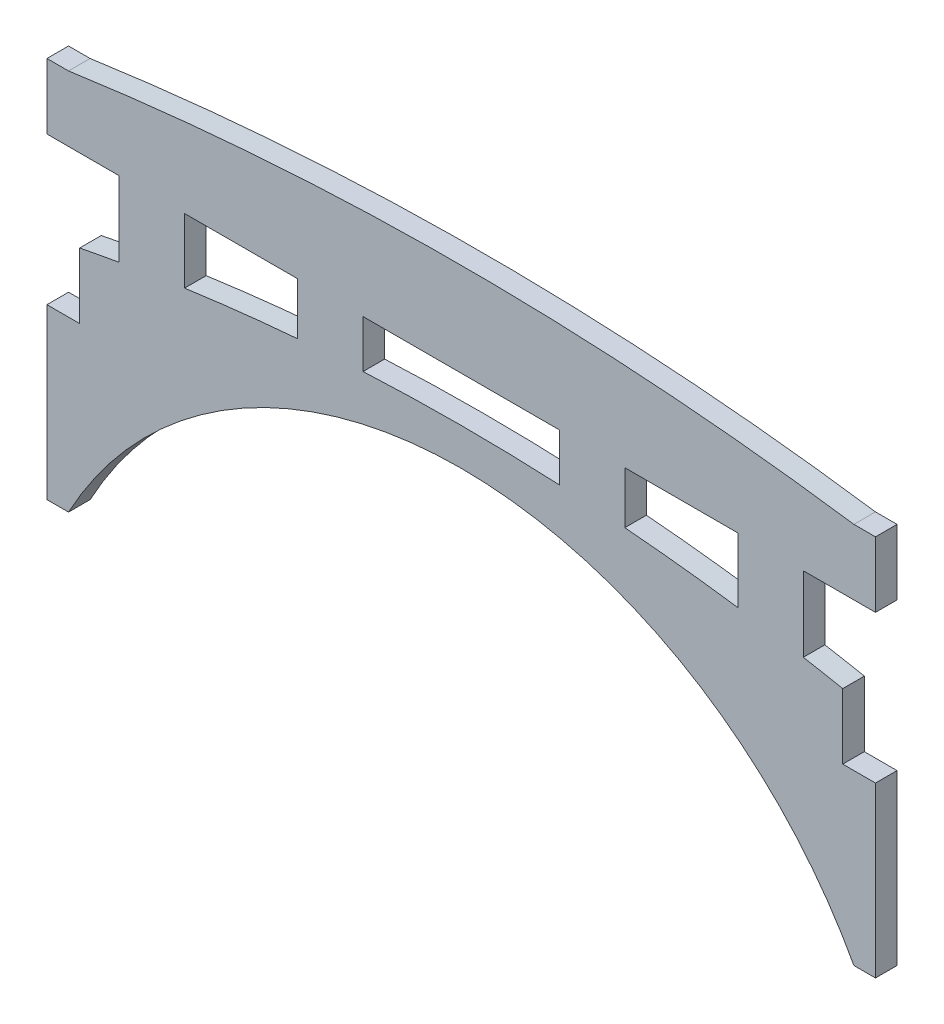
ISO-10303-21;
HEADER;
FILE_DESCRIPTION(('STEP AP214'),'2;1');
FILE_NAME('part.step','',(''),(''),'','','');
FILE_SCHEMA(('AUTOMOTIVE_DESIGN { 1 0 10303 214 1 1 1 1 }'));
ENDSEC;
DATA;
#1=APPLICATION_CONTEXT('core data for automotive mechanical design processes');
#2=APPLICATION_PROTOCOL_DEFINITION('international standard','automotive_design',2000,#1);
#3=PRODUCT_CONTEXT('',#1,'mechanical');
#4=PRODUCT('Part','Part','',(#3));
#5=PRODUCT_RELATED_PRODUCT_CATEGORY('part','',(#4));
#6=PRODUCT_DEFINITION_FORMATION('','',#4);
#7=PRODUCT_DEFINITION_CONTEXT('part definition',#1,'design');
#8=PRODUCT_DEFINITION('design','',#6,#7);
#9=PRODUCT_DEFINITION_SHAPE('','',#8);
#10=(LENGTH_UNIT() NAMED_UNIT(*) SI_UNIT(.MILLI.,.METRE.));
#11=(NAMED_UNIT(*) PLANE_ANGLE_UNIT() SI_UNIT($,.RADIAN.));
#12=(NAMED_UNIT(*) SI_UNIT($,.STERADIAN.) SOLID_ANGLE_UNIT());
#13=UNCERTAINTY_MEASURE_WITH_UNIT(LENGTH_MEASURE(1.E-05),#10,'distance_accuracy_value','');
#14=(GEOMETRIC_REPRESENTATION_CONTEXT(3) GLOBAL_UNCERTAINTY_ASSIGNED_CONTEXT((#13)) GLOBAL_UNIT_ASSIGNED_CONTEXT((#10,
#11,#12)) REPRESENTATION_CONTEXT('',''));
#15=CARTESIAN_POINT('',(0.,0.,0.));
#16=DIRECTION('',(0.,0.,1.));
#17=DIRECTION('',(1.,0.,0.));
#18=AXIS2_PLACEMENT_3D('',#15,#16,#17);
#19=CARTESIAN_POINT('',(60.,-32.3840841295497,3.3));
#20=DIRECTION('',(0.,0.,-1.));
#21=DIRECTION('',(-1.,0.,0.));
#22=AXIS2_PLACEMENT_3D('',#19,#20,#21);
#23=PLANE('',#22);
#24=DIRECTION('',(-1.,0.,0.));
#25=VECTOR('',#24,1.);
#26=CARTESIAN_POINT('',(45.,48.38,3.3));
#27=LINE('',#26,#25);
#28=CARTESIAN_POINT('',(75.,48.38,3.3));
#29=VERTEX_POINT('',#28);
#30=CARTESIAN_POINT('',(45.,48.38,3.3));
#31=VERTEX_POINT('',#30);
#32=EDGE_CURVE('E281',#29,#31,#27,.T.);
#33=ORIENTED_EDGE('',*,*,#32,.F.);
#34=DIRECTION('',(0.,1.,0.));
#35=VECTOR('',#34,1.);
#36=CARTESIAN_POINT('',(75.,48.38,3.3));
#37=LINE('',#36,#35);
#38=CARTESIAN_POINT('',(75.,41.1012105523663,3.3));
#39=VERTEX_POINT('',#38);
#40=EDGE_CURVE('E295',#39,#29,#37,.T.);
#41=ORIENTED_EDGE('',*,*,#40,.F.);
#42=CARTESIAN_POINT('',(60.,-260.904605071318,3.3));
#43=DIRECTION('',(0.,0.,-1.));
#44=DIRECTION('',(-1.,0.,0.));
#45=AXIS2_PLACEMENT_3D('',#42,#43,#44);
#46=CIRCLE('',#45,302.378095553443);
#47=CARTESIAN_POINT('',(45.,41.1012105523663,3.3));
#48=VERTEX_POINT('',#47);
#49=EDGE_CURVE('E288',#48,#39,#46,.T.);
#50=ORIENTED_EDGE('',*,*,#49,.F.);
#51=DIRECTION('',(0.,-1.,0.));
#52=VECTOR('',#51,1.);
#53=CARTESIAN_POINT('',(45.,48.38,3.3));
#54=LINE('',#53,#52);
#55=EDGE_CURVE('E289',#31,#48,#54,.T.);
#56=ORIENTED_EDGE('',*,*,#55,.F.);
#57=EDGE_LOOP('',(#33,#41,#50,#56));
#58=FACE_BOUND('',#57,.T.);
#59=CARTESIAN_POINT('',(60.,-32.3840841295497,3.3));
#60=DIRECTION('',(0.,0.,-1.));
#61=DIRECTION('',(-1.,0.,0.));
#62=AXIS2_PLACEMENT_3D('',#59,#60,#61);
#63=CIRCLE('',#62,68.1815877265245);
#64=CARTESIAN_POINT('',(0.,0.,3.3));
#65=VERTEX_POINT('',#64);
#66=CARTESIAN_POINT('',(120.,0.,3.3));
#67=VERTEX_POINT('',#66);
#68=EDGE_CURVE('E347',#65,#67,#63,.T.);
#69=ORIENTED_EDGE('',*,*,#68,.T.);
#70=DIRECTION('',(1.,0.,0.));
#71=VECTOR('',#70,1.);
#72=CARTESIAN_POINT('',(120.,0.,3.3));
#73=LINE('',#72,#71);
#74=CARTESIAN_POINT('',(123.3,0.,3.3));
#75=VERTEX_POINT('',#74);
#76=EDGE_CURVE('E349',#67,#75,#73,.T.);
#77=ORIENTED_EDGE('',*,*,#76,.T.);
#78=DIRECTION('',(0.,1.,0.));
#79=VECTOR('',#78,1.);
#80=CARTESIAN_POINT('',(123.3,0.,3.3));
#81=LINE('',#80,#79);
#82=CARTESIAN_POINT('',(123.3,25.8,3.3));
#83=VERTEX_POINT('',#82);
#84=EDGE_CURVE('E355',#75,#83,#81,.T.);
#85=ORIENTED_EDGE('',*,*,#84,.T.);
#86=DIRECTION('',(-1.,0.,0.));
#87=VECTOR('',#86,1.);
#88=CARTESIAN_POINT('',(123.3,25.8,3.3));
#89=LINE('',#88,#87);
#90=CARTESIAN_POINT('',(118.3,25.8,3.3));
#91=VERTEX_POINT('',#90);
#92=EDGE_CURVE('E351',#83,#91,#89,.T.);
#93=ORIENTED_EDGE('',*,*,#92,.T.);
#94=DIRECTION('',(0.,1.,0.));
#95=VECTOR('',#94,1.);
#96=CARTESIAN_POINT('',(118.3,25.8,3.3));
#97=LINE('',#96,#95);
#98=CARTESIAN_POINT('',(118.3,35.8,3.3));
#99=VERTEX_POINT('',#98);
#100=EDGE_CURVE('E359',#91,#99,#97,.T.);
#101=ORIENTED_EDGE('',*,*,#100,.T.);
#102=CARTESIAN_POINT('',(60.,-260.904605071318,3.3));
#103=DIRECTION('',(0.,0.,1.));
#104=DIRECTION('',(-1.,0.,0.));
#105=AXIS2_PLACEMENT_3D('',#102,#103,#104);
#106=CIRCLE('',#105,302.378095553443);
#107=CARTESIAN_POINT('',(112.269095695303,36.9216098690764,3.3));
#108=VERTEX_POINT('',#107);
#109=EDGE_CURVE('E360',#99,#108,#106,.T.);
#110=ORIENTED_EDGE('',*,*,#109,.T.);
#111=DIRECTION('',(0.,1.,0.));
#112=VECTOR('',#111,1.);
#113=CARTESIAN_POINT('',(112.269095695303,36.9216098690764,3.3));
#114=LINE('',#113,#112);
#115=CARTESIAN_POINT('',(112.269095695303,48.38,3.3));
#116=VERTEX_POINT('',#115);
#117=EDGE_CURVE('E357',#108,#116,#114,.T.);
#118=ORIENTED_EDGE('',*,*,#117,.T.);
#119=DIRECTION('',(1.,0.,0.));
#120=VECTOR('',#119,1.);
#121=CARTESIAN_POINT('',(112.269095695303,48.38,3.3));
#122=LINE('',#121,#120);
#123=CARTESIAN_POINT('',(123.3,48.38,3.3));
#124=VERTEX_POINT('',#123);
#125=EDGE_CURVE('E362',#116,#124,#122,.T.);
#126=ORIENTED_EDGE('',*,*,#125,.T.);
#127=DIRECTION('',(0.,1.,0.));
#128=VECTOR('',#127,1.);
#129=CARTESIAN_POINT('',(123.3,48.38,3.3));
#130=LINE('',#129,#128);
#131=CARTESIAN_POINT('',(123.3,58.38,3.3));
#132=VERTEX_POINT('',#131);
#133=EDGE_CURVE('E365',#124,#132,#130,.T.);
#134=ORIENTED_EDGE('',*,*,#133,.T.);
#135=DIRECTION('',(-1.,0.,0.));
#136=VECTOR('',#135,1.);
#137=CARTESIAN_POINT('',(123.3,58.38,3.3));
#138=LINE('',#137,#136);
#139=CARTESIAN_POINT('',(120.,58.38,3.3));
#140=VERTEX_POINT('',#139);
#141=EDGE_CURVE('E368',#132,#140,#138,.T.);
#142=ORIENTED_EDGE('',*,*,#141,.T.);
#143=CARTESIAN_POINT('',(60.,-359.120589344752,3.3));
#144=DIRECTION('',(0.,0.,1.));
#145=DIRECTION('',(-1.,0.,0.));
#146=AXIS2_PLACEMENT_3D('',#143,#144,#145);
#147=CIRCLE('',#146,421.789926507516);
#148=CARTESIAN_POINT('',(0.,58.38,3.3));
#149=VERTEX_POINT('',#148);
#150=EDGE_CURVE('E366',#140,#149,#147,.T.);
#151=ORIENTED_EDGE('',*,*,#150,.T.);
#152=DIRECTION('',(-1.,0.,0.));
#153=VECTOR('',#152,1.);
#154=CARTESIAN_POINT('',(-3.3,58.38,3.3));
#155=LINE('',#154,#153);
#156=CARTESIAN_POINT('',(-3.3,58.38,3.3));
#157=VERTEX_POINT('',#156);
#158=EDGE_CURVE('E367',#149,#157,#155,.T.);
#159=ORIENTED_EDGE('',*,*,#158,.T.);
#160=DIRECTION('',(0.,-1.,0.));
#161=VECTOR('',#160,1.);
#162=CARTESIAN_POINT('',(-3.3,48.38,3.3));
#163=LINE('',#162,#161);
#164=CARTESIAN_POINT('',(-3.3,48.38,3.3));
#165=VERTEX_POINT('',#164);
#166=EDGE_CURVE('E375',#157,#165,#163,.T.);
#167=ORIENTED_EDGE('',*,*,#166,.T.);
#168=DIRECTION('',(1.,0.,0.));
#169=VECTOR('',#168,1.);
#170=CARTESIAN_POINT('',(-3.3,48.38,3.3));
#171=LINE('',#170,#169);
#172=CARTESIAN_POINT('',(7.73090430469667,48.38,3.3));
#173=VERTEX_POINT('',#172);
#174=EDGE_CURVE('E372',#165,#173,#171,.T.);
#175=ORIENTED_EDGE('',*,*,#174,.T.);
#176=DIRECTION('',(0.,-1.,0.));
#177=VECTOR('',#176,1.);
#178=CARTESIAN_POINT('',(7.73090430469667,36.9216098690764,3.3));
#179=LINE('',#178,#177);
#180=CARTESIAN_POINT('',(7.73090430469667,36.9216098690764,3.3));
#181=VERTEX_POINT('',#180);
#182=EDGE_CURVE('E376',#173,#181,#179,.T.);
#183=ORIENTED_EDGE('',*,*,#182,.T.);
#184=CARTESIAN_POINT('',(60.,-260.904605071318,3.3));
#185=DIRECTION('',(0.,0.,1.));
#186=DIRECTION('',(-1.,0.,0.));
#187=AXIS2_PLACEMENT_3D('',#184,#185,#186);
#188=CIRCLE('',#187,302.378095553443);
#189=CARTESIAN_POINT('',(1.70000000000001,35.8,3.3));
#190=VERTEX_POINT('',#189);
#191=EDGE_CURVE('E378',#181,#190,#188,.T.);
#192=ORIENTED_EDGE('',*,*,#191,.T.);
#193=DIRECTION('',(0.,-1.,0.));
#194=VECTOR('',#193,1.);
#195=CARTESIAN_POINT('',(1.70000000000001,25.8,3.3));
#196=LINE('',#195,#194);
#197=CARTESIAN_POINT('',(1.70000000000001,25.8,3.3));
#198=VERTEX_POINT('',#197);
#199=EDGE_CURVE('E379',#190,#198,#196,.T.);
#200=ORIENTED_EDGE('',*,*,#199,.T.);
#201=DIRECTION('',(-1.,0.,0.));
#202=VECTOR('',#201,1.);
#203=CARTESIAN_POINT('',(-3.3,25.8,3.3));
#204=LINE('',#203,#202);
#205=CARTESIAN_POINT('',(-3.3,25.8,3.3));
#206=VERTEX_POINT('',#205);
#207=EDGE_CURVE('E385',#198,#206,#204,.T.);
#208=ORIENTED_EDGE('',*,*,#207,.T.);
#209=DIRECTION('',(0.,-1.,0.));
#210=VECTOR('',#209,1.);
#211=CARTESIAN_POINT('',(-3.3,0.,3.3));
#212=LINE('',#211,#210);
#213=CARTESIAN_POINT('',(-3.3,0.,3.3));
#214=VERTEX_POINT('',#213);
#215=EDGE_CURVE('E383',#206,#214,#212,.T.);
#216=ORIENTED_EDGE('',*,*,#215,.T.);
#217=DIRECTION('',(1.,0.,0.));
#218=VECTOR('',#217,1.);
#219=CARTESIAN_POINT('',(0.,0.,3.3));
#220=LINE('',#219,#218);
#221=EDGE_CURVE('E387',#214,#65,#220,.T.);
#222=ORIENTED_EDGE('',*,*,#221,.T.);
#223=EDGE_LOOP('',(#69,#77,#85,#93,#101,#110,#118,#126,#134,#142,#151,#159,#167,#175,#183,#192,
#200,#208,#216,#222));
#224=FACE_BOUND('',#223,.T.);
#225=DIRECTION('',(-1.,0.,0.));
#226=VECTOR('',#225,1.);
#227=CARTESIAN_POINT('',(17.7309043046967,48.38,3.3));
#228=LINE('',#227,#226);
#229=CARTESIAN_POINT('',(35.,48.38,3.3));
#230=VERTEX_POINT('',#229);
#231=CARTESIAN_POINT('',(17.7309043046967,48.38,3.3));
#232=VERTEX_POINT('',#231);
#233=EDGE_CURVE('E312',#230,#232,#228,.T.);
#234=ORIENTED_EDGE('',*,*,#233,.F.);
#235=DIRECTION('',(0.,1.,0.));
#236=VECTOR('',#235,1.);
#237=CARTESIAN_POINT('',(35.,40.4382439736308,3.3));
#238=LINE('',#237,#236);
#239=CARTESIAN_POINT('',(35.,40.4382439736308,3.3));
#240=VERTEX_POINT('',#239);
#241=EDGE_CURVE('E323',#240,#230,#238,.T.);
#242=ORIENTED_EDGE('',*,*,#241,.F.);
#243=CARTESIAN_POINT('',(60.,-260.904605071318,3.3));
#244=DIRECTION('',(0.,0.,-1.));
#245=DIRECTION('',(-1.,0.,0.));
#246=AXIS2_PLACEMENT_3D('',#243,#244,#245);
#247=CIRCLE('',#246,302.378095553443);
#248=CARTESIAN_POINT('',(17.7309043046967,38.5045401123722,3.3));
#249=VERTEX_POINT('',#248);
#250=EDGE_CURVE('E319',#249,#240,#247,.T.);
#251=ORIENTED_EDGE('',*,*,#250,.F.);
#252=DIRECTION('',(0.,-1.,0.));
#253=VECTOR('',#252,1.);
#254=CARTESIAN_POINT('',(17.7309043046967,48.38,3.3));
#255=LINE('',#254,#253);
#256=EDGE_CURVE('E320',#232,#249,#255,.T.);
#257=ORIENTED_EDGE('',*,*,#256,.F.);
#258=EDGE_LOOP('',(#234,#242,#251,#257));
#259=FACE_BOUND('',#258,.T.);
#260=CARTESIAN_POINT('',(60.,-260.904605071318,3.3));
#261=DIRECTION('',(0.,0.,-1.));
#262=DIRECTION('',(-1.,0.,0.));
#263=AXIS2_PLACEMENT_3D('',#260,#261,#262);
#264=CIRCLE('',#263,302.378095553443);
#265=CARTESIAN_POINT('',(85.,40.4382439736308,3.3));
#266=VERTEX_POINT('',#265);
#267=CARTESIAN_POINT('',(102.269095695303,38.5045401123722,3.3));
#268=VERTEX_POINT('',#267);
#269=EDGE_CURVE('E250',#266,#268,#264,.T.);
#270=ORIENTED_EDGE('',*,*,#269,.F.);
#271=DIRECTION('',(0.,-1.,0.));
#272=VECTOR('',#271,1.);
#273=CARTESIAN_POINT('',(85.,40.4382439736308,3.3));
#274=LINE('',#273,#272);
#275=CARTESIAN_POINT('',(85.,48.38,3.3));
#276=VERTEX_POINT('',#275);
#277=EDGE_CURVE('E269',#276,#266,#274,.T.);
#278=ORIENTED_EDGE('',*,*,#277,.F.);
#279=DIRECTION('',(-1.,0.,0.));
#280=VECTOR('',#279,1.);
#281=CARTESIAN_POINT('',(85.,48.38,3.3));
#282=LINE('',#281,#280);
#283=CARTESIAN_POINT('',(102.269095695303,48.38,3.3));
#284=VERTEX_POINT('',#283);
#285=EDGE_CURVE('E268',#284,#276,#282,.T.);
#286=ORIENTED_EDGE('',*,*,#285,.F.);
#287=DIRECTION('',(0.,1.,0.));
#288=VECTOR('',#287,1.);
#289=CARTESIAN_POINT('',(102.269095695303,48.38,3.3));
#290=LINE('',#289,#288);
#291=EDGE_CURVE('E258',#268,#284,#290,.T.);
#292=ORIENTED_EDGE('',*,*,#291,.F.);
#293=EDGE_LOOP('',(#270,#278,#286,#292));
#294=FACE_BOUND('',#293,.T.);
#295=ADVANCED_FACE('F39',(#58,#224,#259,#294),#23,.F.);
#296=CARTESIAN_POINT('',(60.,-32.3840841295497,0.));
#297=DIRECTION('',(0.,0.,-1.));
#298=DIRECTION('',(-1.,0.,0.));
#299=AXIS2_PLACEMENT_3D('',#296,#297,#298);
#300=PLANE('',#299);
#301=CARTESIAN_POINT('',(60.,-32.3840841295497,0.));
#302=DIRECTION('',(0.,0.,-1.));
#303=DIRECTION('',(-1.,0.,0.));
#304=AXIS2_PLACEMENT_3D('',#301,#302,#303);
#305=CIRCLE('',#304,68.1815877265245);
#306=CARTESIAN_POINT('',(0.,0.,0.));
#307=VERTEX_POINT('',#306);
#308=CARTESIAN_POINT('',(120.,0.,0.));
#309=VERTEX_POINT('',#308);
#310=EDGE_CURVE('E342',#307,#309,#305,.T.);
#311=ORIENTED_EDGE('',*,*,#310,.F.);
#312=DIRECTION('',(1.,0.,0.));
#313=VECTOR('',#312,1.);
#314=CARTESIAN_POINT('',(0.,0.,0.));
#315=LINE('',#314,#313);
#316=CARTESIAN_POINT('',(-3.3,0.,0.));
#317=VERTEX_POINT('',#316);
#318=EDGE_CURVE('E348',#317,#307,#315,.T.);
#319=ORIENTED_EDGE('',*,*,#318,.F.);
#320=DIRECTION('',(0.,-1.,0.));
#321=VECTOR('',#320,1.);
#322=CARTESIAN_POINT('',(-3.3,0.,0.));
#323=LINE('',#322,#321);
#324=CARTESIAN_POINT('',(-3.3,25.8,0.));
#325=VERTEX_POINT('',#324);
#326=EDGE_CURVE('E430',#325,#317,#323,.T.);
#327=ORIENTED_EDGE('',*,*,#326,.F.);
#328=DIRECTION('',(-1.,0.,0.));
#329=VECTOR('',#328,1.);
#330=CARTESIAN_POINT('',(-3.3,25.8,0.));
#331=LINE('',#330,#329);
#332=CARTESIAN_POINT('',(1.70000000000001,25.8,0.));
#333=VERTEX_POINT('',#332);
#334=EDGE_CURVE('E422',#333,#325,#331,.T.);
#335=ORIENTED_EDGE('',*,*,#334,.F.);
#336=DIRECTION('',(0.,-1.,0.));
#337=VECTOR('',#336,1.);
#338=CARTESIAN_POINT('',(1.70000000000001,25.8,0.));
#339=LINE('',#338,#337);
#340=CARTESIAN_POINT('',(1.70000000000001,35.8,0.));
#341=VERTEX_POINT('',#340);
#342=EDGE_CURVE('E421',#341,#333,#339,.T.);
#343=ORIENTED_EDGE('',*,*,#342,.F.);
#344=CARTESIAN_POINT('',(60.,-260.904605071318,0.));
#345=DIRECTION('',(0.,0.,1.));
#346=DIRECTION('',(-1.,0.,0.));
#347=AXIS2_PLACEMENT_3D('',#344,#345,#346);
#348=CIRCLE('',#347,302.378095553443);
#349=CARTESIAN_POINT('',(7.73090430469667,36.9216098690764,0.));
#350=VERTEX_POINT('',#349);
#351=EDGE_CURVE('E423',#350,#341,#348,.T.);
#352=ORIENTED_EDGE('',*,*,#351,.F.);
#353=DIRECTION('',(0.,-1.,0.));
#354=VECTOR('',#353,1.);
#355=CARTESIAN_POINT('',(7.73090430469667,36.9216098690764,0.));
#356=LINE('',#355,#354);
#357=CARTESIAN_POINT('',(7.73090430469667,48.38,0.));
#358=VERTEX_POINT('',#357);
#359=EDGE_CURVE('E420',#358,#350,#356,.T.);
#360=ORIENTED_EDGE('',*,*,#359,.F.);
#361=DIRECTION('',(1.,0.,0.));
#362=VECTOR('',#361,1.);
#363=CARTESIAN_POINT('',(1.70000000000001,48.38,0.));
#364=LINE('',#363,#362);
#365=CARTESIAN_POINT('',(-3.3,48.38,0.));
#366=VERTEX_POINT('',#365);
#367=EDGE_CURVE('E417',#366,#358,#364,.T.);
#368=ORIENTED_EDGE('',*,*,#367,.F.);
#369=DIRECTION('',(0.,-1.,0.));
#370=VECTOR('',#369,1.);
#371=CARTESIAN_POINT('',(-3.3,48.38,0.));
#372=LINE('',#371,#370);
#373=CARTESIAN_POINT('',(-3.3,58.38,0.));
#374=VERTEX_POINT('',#373);
#375=EDGE_CURVE('E413',#374,#366,#372,.T.);
#376=ORIENTED_EDGE('',*,*,#375,.F.);
#377=DIRECTION('',(-1.,0.,0.));
#378=VECTOR('',#377,1.);
#379=CARTESIAN_POINT('',(-3.3,58.38,0.));
#380=LINE('',#379,#378);
#381=CARTESIAN_POINT('',(0.,58.38,0.));
#382=VERTEX_POINT('',#381);
#383=EDGE_CURVE('E411',#382,#374,#380,.T.);
#384=ORIENTED_EDGE('',*,*,#383,.F.);
#385=CARTESIAN_POINT('',(60.,-359.120589344752,0.));
#386=DIRECTION('',(0.,0.,1.));
#387=DIRECTION('',(-1.,0.,0.));
#388=AXIS2_PLACEMENT_3D('',#385,#386,#387);
#389=CIRCLE('',#388,421.789926507516);
#390=CARTESIAN_POINT('',(120.,58.38,0.));
#391=VERTEX_POINT('',#390);
#392=EDGE_CURVE('E408',#391,#382,#389,.T.);
#393=ORIENTED_EDGE('',*,*,#392,.F.);
#394=DIRECTION('',(-1.,0.,0.));
#395=VECTOR('',#394,1.);
#396=CARTESIAN_POINT('',(123.3,58.38,0.));
#397=LINE('',#396,#395);
#398=CARTESIAN_POINT('',(123.3,58.38,0.));
#399=VERTEX_POINT('',#398);
#400=EDGE_CURVE('E409',#399,#391,#397,.T.);
#401=ORIENTED_EDGE('',*,*,#400,.F.);
#402=DIRECTION('',(0.,1.,0.));
#403=VECTOR('',#402,1.);
#404=CARTESIAN_POINT('',(123.3,48.38,0.));
#405=LINE('',#404,#403);
#406=CARTESIAN_POINT('',(123.3,48.38,0.));
#407=VERTEX_POINT('',#406);
#408=EDGE_CURVE('E407',#407,#399,#405,.T.);
#409=ORIENTED_EDGE('',*,*,#408,.F.);
#410=DIRECTION('',(1.,0.,0.));
#411=VECTOR('',#410,1.);
#412=CARTESIAN_POINT('',(123.3,48.38,0.));
#413=LINE('',#412,#411);
#414=CARTESIAN_POINT('',(112.269095695303,48.38,0.));
#415=VERTEX_POINT('',#414);
#416=EDGE_CURVE('E404',#415,#407,#413,.T.);
#417=ORIENTED_EDGE('',*,*,#416,.F.);
#418=DIRECTION('',(0.,1.,0.));
#419=VECTOR('',#418,1.);
#420=CARTESIAN_POINT('',(112.269095695303,36.9216098690764,0.));
#421=LINE('',#420,#419);
#422=CARTESIAN_POINT('',(112.269095695303,36.9216098690764,0.));
#423=VERTEX_POINT('',#422);
#424=EDGE_CURVE('E402',#423,#415,#421,.T.);
#425=ORIENTED_EDGE('',*,*,#424,.F.);
#426=CARTESIAN_POINT('',(60.,-260.904605071318,0.));
#427=DIRECTION('',(0.,0.,1.));
#428=DIRECTION('',(-1.,0.,0.));
#429=AXIS2_PLACEMENT_3D('',#426,#427,#428);
#430=CIRCLE('',#429,302.378095553443);
#431=CARTESIAN_POINT('',(118.3,35.8,0.));
#432=VERTEX_POINT('',#431);
#433=EDGE_CURVE('E398',#432,#423,#430,.T.);
#434=ORIENTED_EDGE('',*,*,#433,.F.);
#435=DIRECTION('',(0.,1.,0.));
#436=VECTOR('',#435,1.);
#437=CARTESIAN_POINT('',(118.3,25.8,0.));
#438=LINE('',#437,#436);
#439=CARTESIAN_POINT('',(118.3,25.8,0.));
#440=VERTEX_POINT('',#439);
#441=EDGE_CURVE('E396',#440,#432,#438,.T.);
#442=ORIENTED_EDGE('',*,*,#441,.F.);
#443=DIRECTION('',(-1.,0.,0.));
#444=VECTOR('',#443,1.);
#445=CARTESIAN_POINT('',(123.3,25.8,0.));
#446=LINE('',#445,#444);
#447=CARTESIAN_POINT('',(123.3,25.8,0.));
#448=VERTEX_POINT('',#447);
#449=EDGE_CURVE('E393',#448,#440,#446,.T.);
#450=ORIENTED_EDGE('',*,*,#449,.F.);
#451=DIRECTION('',(0.,1.,0.));
#452=VECTOR('',#451,1.);
#453=CARTESIAN_POINT('',(123.3,0.,0.));
#454=LINE('',#453,#452);
#455=CARTESIAN_POINT('',(123.3,0.,0.));
#456=VERTEX_POINT('',#455);
#457=EDGE_CURVE('E394',#456,#448,#454,.T.);
#458=ORIENTED_EDGE('',*,*,#457,.F.);
#459=DIRECTION('',(1.,0.,0.));
#460=VECTOR('',#459,1.);
#461=CARTESIAN_POINT('',(120.,0.,0.));
#462=LINE('',#461,#460);
#463=EDGE_CURVE('E392',#309,#456,#462,.T.);
#464=ORIENTED_EDGE('',*,*,#463,.F.);
#465=EDGE_LOOP('',(#311,#319,#327,#335,#343,#352,#360,#368,#376,#384,#393,#401,#409,#417,#425,
#434,#442,#450,#458,#464));
#466=FACE_BOUND('',#465,.T.);
#467=DIRECTION('',(0.,1.,0.));
#468=VECTOR('',#467,1.);
#469=CARTESIAN_POINT('',(35.,40.4382439736308,0.));
#470=LINE('',#469,#468);
#471=CARTESIAN_POINT('',(35.,40.4382439736308,0.));
#472=VERTEX_POINT('',#471);
#473=CARTESIAN_POINT('',(35.,48.38,0.));
#474=VERTEX_POINT('',#473);
#475=EDGE_CURVE('E318',#472,#474,#470,.T.);
#476=ORIENTED_EDGE('',*,*,#475,.T.);
#477=DIRECTION('',(-1.,0.,0.));
#478=VECTOR('',#477,1.);
#479=CARTESIAN_POINT('',(17.7309043046967,48.38,0.));
#480=LINE('',#479,#478);
#481=CARTESIAN_POINT('',(17.7309043046967,48.38,0.));
#482=VERTEX_POINT('',#481);
#483=EDGE_CURVE('E314',#474,#482,#480,.T.);
#484=ORIENTED_EDGE('',*,*,#483,.T.);
#485=DIRECTION('',(0.,-1.,0.));
#486=VECTOR('',#485,1.);
#487=CARTESIAN_POINT('',(17.7309043046967,48.38,0.));
#488=LINE('',#487,#486);
#489=CARTESIAN_POINT('',(17.7309043046967,38.5045401123722,0.));
#490=VERTEX_POINT('',#489);
#491=EDGE_CURVE('E327',#482,#490,#488,.T.);
#492=ORIENTED_EDGE('',*,*,#491,.T.);
#493=CARTESIAN_POINT('',(60.,-260.904605071318,0.));
#494=DIRECTION('',(0.,0.,-1.));
#495=DIRECTION('',(-1.,0.,0.));
#496=AXIS2_PLACEMENT_3D('',#493,#494,#495);
#497=CIRCLE('',#496,302.378095553443);
#498=EDGE_CURVE('E332',#490,#472,#497,.T.);
#499=ORIENTED_EDGE('',*,*,#498,.T.);
#500=EDGE_LOOP('',(#476,#484,#492,#499));
#501=FACE_BOUND('',#500,.T.);
#502=DIRECTION('',(0.,1.,0.));
#503=VECTOR('',#502,1.);
#504=CARTESIAN_POINT('',(75.,48.38,0.));
#505=LINE('',#504,#503);
#506=CARTESIAN_POINT('',(75.,41.1012105523663,0.));
#507=VERTEX_POINT('',#506);
#508=CARTESIAN_POINT('',(75.,48.38,0.));
#509=VERTEX_POINT('',#508);
#510=EDGE_CURVE('E286',#507,#509,#505,.T.);
#511=ORIENTED_EDGE('',*,*,#510,.T.);
#512=DIRECTION('',(-1.,0.,0.));
#513=VECTOR('',#512,1.);
#514=CARTESIAN_POINT('',(45.,48.38,0.));
#515=LINE('',#514,#513);
#516=CARTESIAN_POINT('',(45.,48.38,0.));
#517=VERTEX_POINT('',#516);
#518=EDGE_CURVE('E262',#509,#517,#515,.T.);
#519=ORIENTED_EDGE('',*,*,#518,.T.);
#520=DIRECTION('',(0.,-1.,0.));
#521=VECTOR('',#520,1.);
#522=CARTESIAN_POINT('',(45.,48.38,0.));
#523=LINE('',#522,#521);
#524=CARTESIAN_POINT('',(45.,41.1012105523663,0.));
#525=VERTEX_POINT('',#524);
#526=EDGE_CURVE('E300',#517,#525,#523,.T.);
#527=ORIENTED_EDGE('',*,*,#526,.T.);
#528=CARTESIAN_POINT('',(60.,-260.904605071318,0.));
#529=DIRECTION('',(0.,0.,-1.));
#530=DIRECTION('',(-1.,0.,0.));
#531=AXIS2_PLACEMENT_3D('',#528,#529,#530);
#532=CIRCLE('',#531,302.378095553443);
#533=EDGE_CURVE('E298',#525,#507,#532,.T.);
#534=ORIENTED_EDGE('',*,*,#533,.T.);
#535=EDGE_LOOP('',(#511,#519,#527,#534));
#536=FACE_BOUND('',#535,.T.);
#537=DIRECTION('',(0.,-1.,0.));
#538=VECTOR('',#537,1.);
#539=CARTESIAN_POINT('',(85.,40.4382439736308,0.));
#540=LINE('',#539,#538);
#541=CARTESIAN_POINT('',(85.,48.38,0.));
#542=VERTEX_POINT('',#541);
#543=CARTESIAN_POINT('',(85.,40.4382439736308,0.));
#544=VERTEX_POINT('',#543);
#545=EDGE_CURVE('E260',#542,#544,#540,.T.);
#546=ORIENTED_EDGE('',*,*,#545,.T.);
#547=CARTESIAN_POINT('',(60.,-260.904605071318,0.));
#548=DIRECTION('',(0.,0.,-1.));
#549=DIRECTION('',(-1.,0.,0.));
#550=AXIS2_PLACEMENT_3D('',#547,#548,#549);
#551=CIRCLE('',#550,302.378095553443);
#552=CARTESIAN_POINT('',(102.269095695303,38.5045401123722,0.));
#553=VERTEX_POINT('',#552);
#554=EDGE_CURVE('E65',#544,#553,#551,.T.);
#555=ORIENTED_EDGE('',*,*,#554,.T.);
#556=DIRECTION('',(0.,1.,0.));
#557=VECTOR('',#556,1.);
#558=CARTESIAN_POINT('',(102.269095695303,48.38,0.));
#559=LINE('',#558,#557);
#560=CARTESIAN_POINT('',(102.269095695303,48.38,0.));
#561=VERTEX_POINT('',#560);
#562=EDGE_CURVE('E263',#553,#561,#559,.T.);
#563=ORIENTED_EDGE('',*,*,#562,.T.);
#564=DIRECTION('',(-1.,0.,0.));
#565=VECTOR('',#564,1.);
#566=CARTESIAN_POINT('',(85.,48.38,0.));
#567=LINE('',#566,#565);
#568=EDGE_CURVE('E277',#561,#542,#567,.T.);
#569=ORIENTED_EDGE('',*,*,#568,.T.);
#570=EDGE_LOOP('',(#546,#555,#563,#569));
#571=FACE_BOUND('',#570,.T.);
#572=ADVANCED_FACE('F492',(#466,#501,#536,#571),#300,.T.);
#573=CARTESIAN_POINT('',(60.,-32.3840841295497,3.3));
#574=DIRECTION('',(0.,0.,-1.));
#575=DIRECTION('',(-1.,0.,0.));
#576=AXIS2_PLACEMENT_3D('',#573,#574,#575);
#577=CYLINDRICAL_SURFACE('',#576,68.1815877265245);
#578=ORIENTED_EDGE('',*,*,#310,.T.);
#579=DIRECTION('',(0.,0.,-1.));
#580=VECTOR('',#579,1.);
#581=CARTESIAN_POINT('',(120.,0.,3.3));
#582=LINE('',#581,#580);
#583=EDGE_CURVE('E11',#67,#309,#582,.T.);
#584=ORIENTED_EDGE('',*,*,#583,.F.);
#585=ORIENTED_EDGE('',*,*,#68,.F.);
#586=DIRECTION('',(0.,0.,-1.));
#587=VECTOR('',#586,1.);
#588=CARTESIAN_POINT('',(0.,0.,3.3));
#589=LINE('',#588,#587);
#590=EDGE_CURVE('E389',#65,#307,#589,.T.);
#591=ORIENTED_EDGE('',*,*,#590,.T.);
#592=EDGE_LOOP('',(#578,#584,#585,#591));
#593=FACE_BOUND('',#592,.T.);
#594=ADVANCED_FACE('F41',(#593),#577,.F.);
#595=CARTESIAN_POINT('',(120.,0.,3.3));
#596=DIRECTION('',(0.,1.,0.));
#597=DIRECTION('',(0.,0.,1.));
#598=AXIS2_PLACEMENT_3D('',#595,#596,#597);
#599=PLANE('',#598);
#600=ORIENTED_EDGE('',*,*,#463,.T.);
#601=DIRECTION('',(0.,0.,-1.));
#602=VECTOR('',#601,1.);
#603=CARTESIAN_POINT('',(123.3,0.,3.3));
#604=LINE('',#603,#602);
#605=EDGE_CURVE('E50',#75,#456,#604,.T.);
#606=ORIENTED_EDGE('',*,*,#605,.F.);
#607=ORIENTED_EDGE('',*,*,#76,.F.);
#608=ORIENTED_EDGE('',*,*,#583,.T.);
#609=EDGE_LOOP('',(#600,#606,#607,#608));
#610=FACE_BOUND('',#609,.T.);
#611=ADVANCED_FACE('F512',(#610),#599,.F.);
#612=CARTESIAN_POINT('',(123.3,0.,3.3));
#613=DIRECTION('',(-1.,0.,0.));
#614=DIRECTION('',(0.,0.,1.));
#615=AXIS2_PLACEMENT_3D('',#612,#613,#614);
#616=PLANE('',#615);
#617=ORIENTED_EDGE('',*,*,#457,.T.);
#618=DIRECTION('',(0.,0.,-1.));
#619=VECTOR('',#618,1.);
#620=CARTESIAN_POINT('',(123.3,25.8,3.3));
#621=LINE('',#620,#619);
#622=EDGE_CURVE('E477',#83,#448,#621,.T.);
#623=ORIENTED_EDGE('',*,*,#622,.F.);
#624=ORIENTED_EDGE('',*,*,#84,.F.);
#625=ORIENTED_EDGE('',*,*,#605,.T.);
#626=EDGE_LOOP('',(#617,#623,#624,#625));
#627=FACE_BOUND('',#626,.T.);
#628=ADVANCED_FACE('F490',(#627),#616,.F.);
#629=CARTESIAN_POINT('',(123.3,25.8,3.3));
#630=DIRECTION('',(0.,-1.,0.));
#631=DIRECTION('',(0.,0.,-1.));
#632=AXIS2_PLACEMENT_3D('',#629,#630,#631);
#633=PLANE('',#632);
#634=ORIENTED_EDGE('',*,*,#449,.T.);
#635=DIRECTION('',(0.,0.,-1.));
#636=VECTOR('',#635,1.);
#637=CARTESIAN_POINT('',(118.3,25.8,3.3));
#638=LINE('',#637,#636);
#639=EDGE_CURVE('E480',#91,#440,#638,.T.);
#640=ORIENTED_EDGE('',*,*,#639,.F.);
#641=ORIENTED_EDGE('',*,*,#92,.F.);
#642=ORIENTED_EDGE('',*,*,#622,.T.);
#643=EDGE_LOOP('',(#634,#640,#641,#642));
#644=FACE_BOUND('',#643,.T.);
#645=ADVANCED_FACE('F496',(#644),#633,.F.);
#646=CARTESIAN_POINT('',(118.3,25.8,3.3));
#647=DIRECTION('',(-1.,0.,0.));
#648=DIRECTION('',(0.,0.,1.));
#649=AXIS2_PLACEMENT_3D('',#646,#647,#648);
#650=PLANE('',#649);
#651=ORIENTED_EDGE('',*,*,#441,.T.);
#652=DIRECTION('',(0.,0.,-1.));
#653=VECTOR('',#652,1.);
#654=CARTESIAN_POINT('',(118.3,35.8,3.3));
#655=LINE('',#654,#653);
#656=EDGE_CURVE('E475',#99,#432,#655,.T.);
#657=ORIENTED_EDGE('',*,*,#656,.F.);
#658=ORIENTED_EDGE('',*,*,#100,.F.);
#659=ORIENTED_EDGE('',*,*,#639,.T.);
#660=EDGE_LOOP('',(#651,#657,#658,#659));
#661=FACE_BOUND('',#660,.T.);
#662=ADVANCED_FACE('F504',(#661),#650,.F.);
#663=CARTESIAN_POINT('',(60.,-260.904605071318,3.3));
#664=DIRECTION('',(0.,0.,-1.));
#665=DIRECTION('',(-1.,0.,0.));
#666=AXIS2_PLACEMENT_3D('',#663,#664,#665);
#667=CYLINDRICAL_SURFACE('',#666,302.378095553443);
#668=ORIENTED_EDGE('',*,*,#433,.T.);
#669=DIRECTION('',(0.,0.,-1.));
#670=VECTOR('',#669,1.);
#671=CARTESIAN_POINT('',(112.269095695303,36.9216098690764,3.3));
#672=LINE('',#671,#670);
#673=EDGE_CURVE('E473',#108,#423,#672,.T.);
#674=ORIENTED_EDGE('',*,*,#673,.F.);
#675=ORIENTED_EDGE('',*,*,#109,.F.);
#676=ORIENTED_EDGE('',*,*,#656,.T.);
#677=EDGE_LOOP('',(#668,#674,#675,#676));
#678=FACE_BOUND('',#677,.T.);
#679=ADVANCED_FACE('F586',(#678),#667,.T.);
#680=CARTESIAN_POINT('',(112.269095695303,36.9216098690764,3.3));
#681=DIRECTION('',(-1.,0.,0.));
#682=DIRECTION('',(0.,-1.,0.));
#683=AXIS2_PLACEMENT_3D('',#680,#681,#682);
#684=PLANE('',#683);
#685=ORIENTED_EDGE('',*,*,#424,.T.);
#686=DIRECTION('',(0.,0.,-1.));
#687=VECTOR('',#686,1.);
#688=CARTESIAN_POINT('',(112.269095695303,48.38,3.3));
#689=LINE('',#688,#687);
#690=EDGE_CURVE('E470',#116,#415,#689,.T.);
#691=ORIENTED_EDGE('',*,*,#690,.F.);
#692=ORIENTED_EDGE('',*,*,#117,.F.);
#693=ORIENTED_EDGE('',*,*,#673,.T.);
#694=EDGE_LOOP('',(#685,#691,#692,#693));
#695=FACE_BOUND('',#694,.T.);
#696=ADVANCED_FACE('F576',(#695),#684,.F.);
#697=CARTESIAN_POINT('',(123.3,48.38,3.3));
#698=DIRECTION('',(0.,1.,0.));
#699=DIRECTION('',(-1.,0.,0.));
#700=AXIS2_PLACEMENT_3D('',#697,#698,#699);
#701=PLANE('',#700);
#702=ORIENTED_EDGE('',*,*,#416,.T.);
#703=DIRECTION('',(0.,0.,-1.));
#704=VECTOR('',#703,1.);
#705=CARTESIAN_POINT('',(123.3,48.38,3.3));
#706=LINE('',#705,#704);
#707=EDGE_CURVE('E463',#124,#407,#706,.T.);
#708=ORIENTED_EDGE('',*,*,#707,.F.);
#709=ORIENTED_EDGE('',*,*,#125,.F.);
#710=ORIENTED_EDGE('',*,*,#690,.T.);
#711=EDGE_LOOP('',(#702,#708,#709,#710));
#712=FACE_BOUND('',#711,.T.);
#713=ADVANCED_FACE('F577',(#712),#701,.F.);
#714=CARTESIAN_POINT('',(123.3,48.38,3.3));
#715=DIRECTION('',(-1.,0.,0.));
#716=DIRECTION('',(0.,0.,1.));
#717=AXIS2_PLACEMENT_3D('',#714,#715,#716);
#718=PLANE('',#717);
#719=ORIENTED_EDGE('',*,*,#408,.T.);
#720=DIRECTION('',(0.,0.,-1.));
#721=VECTOR('',#720,1.);
#722=CARTESIAN_POINT('',(123.3,58.38,3.3));
#723=LINE('',#722,#721);
#724=EDGE_CURVE('E465',#132,#399,#723,.T.);
#725=ORIENTED_EDGE('',*,*,#724,.F.);
#726=ORIENTED_EDGE('',*,*,#133,.F.);
#727=ORIENTED_EDGE('',*,*,#707,.T.);
#728=EDGE_LOOP('',(#719,#725,#726,#727));
#729=FACE_BOUND('',#728,.T.);
#730=ADVANCED_FACE('F572',(#729),#718,.F.);
#731=CARTESIAN_POINT('',(123.3,58.38,3.3));
#732=DIRECTION('',(0.,-1.,0.));
#733=DIRECTION('',(1.,0.,0.));
#734=AXIS2_PLACEMENT_3D('',#731,#732,#733);
#735=PLANE('',#734);
#736=ORIENTED_EDGE('',*,*,#400,.T.);
#737=DIRECTION('',(0.,0.,-1.));
#738=VECTOR('',#737,1.);
#739=CARTESIAN_POINT('',(120.,58.38,3.3));
#740=LINE('',#739,#738);
#741=EDGE_CURVE('E459',#140,#391,#740,.T.);
#742=ORIENTED_EDGE('',*,*,#741,.F.);
#743=ORIENTED_EDGE('',*,*,#141,.F.);
#744=ORIENTED_EDGE('',*,*,#724,.T.);
#745=EDGE_LOOP('',(#736,#742,#743,#744));
#746=FACE_BOUND('',#745,.T.);
#747=ADVANCED_FACE('F570',(#746),#735,.F.);
#748=CARTESIAN_POINT('',(60.,-359.120589344752,3.3));
#749=DIRECTION('',(0.,0.,-1.));
#750=DIRECTION('',(-1.,0.,0.));
#751=AXIS2_PLACEMENT_3D('',#748,#749,#750);
#752=CYLINDRICAL_SURFACE('',#751,421.789926507516);
#753=ORIENTED_EDGE('',*,*,#392,.T.);
#754=DIRECTION('',(0.,0.,-1.));
#755=VECTOR('',#754,1.);
#756=CARTESIAN_POINT('',(0.,58.38,3.3));
#757=LINE('',#756,#755);
#758=EDGE_CURVE('E457',#149,#382,#757,.T.);
#759=ORIENTED_EDGE('',*,*,#758,.F.);
#760=ORIENTED_EDGE('',*,*,#150,.F.);
#761=ORIENTED_EDGE('',*,*,#741,.T.);
#762=EDGE_LOOP('',(#753,#759,#760,#761));
#763=FACE_BOUND('',#762,.T.);
#764=ADVANCED_FACE('F565',(#763),#752,.T.);
#765=CARTESIAN_POINT('',(-3.3,58.38,3.3));
#766=DIRECTION('',(0.,-1.,0.));
#767=DIRECTION('',(1.,0.,0.));
#768=AXIS2_PLACEMENT_3D('',#765,#766,#767);
#769=PLANE('',#768);
#770=ORIENTED_EDGE('',*,*,#383,.T.);
#771=DIRECTION('',(0.,0.,-1.));
#772=VECTOR('',#771,1.);
#773=CARTESIAN_POINT('',(-3.3,58.38,3.3));
#774=LINE('',#773,#772);
#775=EDGE_CURVE('E455',#157,#374,#774,.T.);
#776=ORIENTED_EDGE('',*,*,#775,.F.);
#777=ORIENTED_EDGE('',*,*,#158,.F.);
#778=ORIENTED_EDGE('',*,*,#758,.T.);
#779=EDGE_LOOP('',(#770,#776,#777,#778));
#780=FACE_BOUND('',#779,.T.);
#781=ADVANCED_FACE('F559',(#780),#769,.F.);
#782=CARTESIAN_POINT('',(-3.3,48.38,3.3));
#783=DIRECTION('',(1.,0.,0.));
#784=DIRECTION('',(0.,0.,-1.));
#785=AXIS2_PLACEMENT_3D('',#782,#783,#784);
#786=PLANE('',#785);
#787=ORIENTED_EDGE('',*,*,#375,.T.);
#788=DIRECTION('',(0.,0.,-1.));
#789=VECTOR('',#788,1.);
#790=CARTESIAN_POINT('',(-3.3,48.38,3.3));
#791=LINE('',#790,#789);
#792=EDGE_CURVE('E448',#165,#366,#791,.T.);
#793=ORIENTED_EDGE('',*,*,#792,.F.);
#794=ORIENTED_EDGE('',*,*,#166,.F.);
#795=ORIENTED_EDGE('',*,*,#775,.T.);
#796=EDGE_LOOP('',(#787,#793,#794,#795));
#797=FACE_BOUND('',#796,.T.);
#798=ADVANCED_FACE('F548',(#797),#786,.F.);
#799=CARTESIAN_POINT('',(1.70000000000001,48.38,3.3));
#800=DIRECTION('',(0.,1.,0.));
#801=DIRECTION('',(-1.,0.,0.));
#802=AXIS2_PLACEMENT_3D('',#799,#800,#801);
#803=PLANE('',#802);
#804=ORIENTED_EDGE('',*,*,#367,.T.);
#805=DIRECTION('',(0.,0.,-1.));
#806=VECTOR('',#805,1.);
#807=CARTESIAN_POINT('',(7.73090430469667,48.38,3.3));
#808=LINE('',#807,#806);
#809=EDGE_CURVE('E450',#173,#358,#808,.T.);
#810=ORIENTED_EDGE('',*,*,#809,.F.);
#811=ORIENTED_EDGE('',*,*,#174,.F.);
#812=ORIENTED_EDGE('',*,*,#792,.T.);
#813=EDGE_LOOP('',(#804,#810,#811,#812));
#814=FACE_BOUND('',#813,.T.);
#815=ADVANCED_FACE('F554',(#814),#803,.F.);
#816=CARTESIAN_POINT('',(7.73090430469667,36.9216098690764,3.3));
#817=DIRECTION('',(1.,0.,0.));
#818=DIRECTION('',(0.,1.,0.));
#819=AXIS2_PLACEMENT_3D('',#816,#817,#818);
#820=PLANE('',#819);
#821=ORIENTED_EDGE('',*,*,#359,.T.);
#822=DIRECTION('',(0.,0.,-1.));
#823=VECTOR('',#822,1.);
#824=CARTESIAN_POINT('',(7.73090430469667,36.9216098690764,3.3));
#825=LINE('',#824,#823);
#826=EDGE_CURVE('E441',#181,#350,#825,.T.);
#827=ORIENTED_EDGE('',*,*,#826,.F.);
#828=ORIENTED_EDGE('',*,*,#182,.F.);
#829=ORIENTED_EDGE('',*,*,#809,.T.);
#830=EDGE_LOOP('',(#821,#827,#828,#829));
#831=FACE_BOUND('',#830,.T.);
#832=ADVANCED_FACE('F545',(#831),#820,.F.);
#833=CARTESIAN_POINT('',(60.,-260.904605071318,3.3));
#834=DIRECTION('',(0.,0.,-1.));
#835=DIRECTION('',(-1.,0.,0.));
#836=AXIS2_PLACEMENT_3D('',#833,#834,#835);
#837=CYLINDRICAL_SURFACE('',#836,302.378095553443);
#838=ORIENTED_EDGE('',*,*,#351,.T.);
#839=DIRECTION('',(0.,0.,-1.));
#840=VECTOR('',#839,1.);
#841=CARTESIAN_POINT('',(1.70000000000001,35.8,3.3));
#842=LINE('',#841,#840);
#843=EDGE_CURVE('E442',#190,#341,#842,.T.);
#844=ORIENTED_EDGE('',*,*,#843,.F.);
#845=ORIENTED_EDGE('',*,*,#191,.F.);
#846=ORIENTED_EDGE('',*,*,#826,.T.);
#847=EDGE_LOOP('',(#838,#844,#845,#846));
#848=FACE_BOUND('',#847,.T.);
#849=ADVANCED_FACE('F538',(#848),#837,.T.);
#850=CARTESIAN_POINT('',(1.70000000000001,25.8,3.3));
#851=DIRECTION('',(1.,0.,0.));
#852=DIRECTION('',(0.,0.,-1.));
#853=AXIS2_PLACEMENT_3D('',#850,#851,#852);
#854=PLANE('',#853);
#855=ORIENTED_EDGE('',*,*,#342,.T.);
#856=DIRECTION('',(0.,0.,-1.));
#857=VECTOR('',#856,1.);
#858=CARTESIAN_POINT('',(1.70000000000001,25.8,3.3));
#859=LINE('',#858,#857);
#860=EDGE_CURVE('E437',#198,#333,#859,.T.);
#861=ORIENTED_EDGE('',*,*,#860,.F.);
#862=ORIENTED_EDGE('',*,*,#199,.F.);
#863=ORIENTED_EDGE('',*,*,#843,.T.);
#864=EDGE_LOOP('',(#855,#861,#862,#863));
#865=FACE_BOUND('',#864,.T.);
#866=ADVANCED_FACE('F531',(#865),#854,.F.);
#867=CARTESIAN_POINT('',(-3.3,25.8,3.3));
#868=DIRECTION('',(0.,-1.,0.));
#869=DIRECTION('',(0.,0.,-1.));
#870=AXIS2_PLACEMENT_3D('',#867,#868,#869);
#871=PLANE('',#870);
#872=ORIENTED_EDGE('',*,*,#334,.T.);
#873=DIRECTION('',(0.,0.,-1.));
#874=VECTOR('',#873,1.);
#875=CARTESIAN_POINT('',(-3.3,25.8,3.3));
#876=LINE('',#875,#874);
#877=EDGE_CURVE('E434',#206,#325,#876,.T.);
#878=ORIENTED_EDGE('',*,*,#877,.F.);
#879=ORIENTED_EDGE('',*,*,#207,.F.);
#880=ORIENTED_EDGE('',*,*,#860,.T.);
#881=EDGE_LOOP('',(#872,#878,#879,#880));
#882=FACE_BOUND('',#881,.T.);
#883=ADVANCED_FACE('F527',(#882),#871,.F.);
#884=CARTESIAN_POINT('',(-3.3,0.,3.3));
#885=DIRECTION('',(1.,0.,0.));
#886=DIRECTION('',(0.,0.,-1.));
#887=AXIS2_PLACEMENT_3D('',#884,#885,#886);
#888=PLANE('',#887);
#889=ORIENTED_EDGE('',*,*,#326,.T.);
#890=DIRECTION('',(0.,0.,-1.));
#891=VECTOR('',#890,1.);
#892=CARTESIAN_POINT('',(-3.3,0.,3.3));
#893=LINE('',#892,#891);
#894=EDGE_CURVE('E435',#214,#317,#893,.T.);
#895=ORIENTED_EDGE('',*,*,#894,.F.);
#896=ORIENTED_EDGE('',*,*,#215,.F.);
#897=ORIENTED_EDGE('',*,*,#877,.T.);
#898=EDGE_LOOP('',(#889,#895,#896,#897));
#899=FACE_BOUND('',#898,.T.);
#900=ADVANCED_FACE('F525',(#899),#888,.F.);
#901=CARTESIAN_POINT('',(0.,0.,3.3));
#902=DIRECTION('',(0.,1.,0.));
#903=DIRECTION('',(0.,0.,1.));
#904=AXIS2_PLACEMENT_3D('',#901,#902,#903);
#905=PLANE('',#904);
#906=ORIENTED_EDGE('',*,*,#318,.T.);
#907=ORIENTED_EDGE('',*,*,#590,.F.);
#908=ORIENTED_EDGE('',*,*,#221,.F.);
#909=ORIENTED_EDGE('',*,*,#894,.T.);
#910=EDGE_LOOP('',(#906,#907,#908,#909));
#911=FACE_BOUND('',#910,.T.);
#912=ADVANCED_FACE('F519',(#911),#905,.F.);
#913=CARTESIAN_POINT('',(17.7309043046967,48.38,3.3));
#914=DIRECTION('',(0.,-1.,0.));
#915=DIRECTION('',(0.,0.,-1.));
#916=AXIS2_PLACEMENT_3D('',#913,#914,#915);
#917=PLANE('',#916);
#918=ORIENTED_EDGE('',*,*,#483,.F.);
#919=DIRECTION('',(0.,0.,-1.));
#920=VECTOR('',#919,1.);
#921=CARTESIAN_POINT('',(35.,48.38,3.3));
#922=LINE('',#921,#920);
#923=EDGE_CURVE('E324',#230,#474,#922,.T.);
#924=ORIENTED_EDGE('',*,*,#923,.F.);
#925=ORIENTED_EDGE('',*,*,#233,.T.);
#926=DIRECTION('',(0.,0.,-1.));
#927=VECTOR('',#926,1.);
#928=CARTESIAN_POINT('',(17.7309043046967,48.38,3.3));
#929=LINE('',#928,#927);
#930=EDGE_CURVE('E341',#232,#482,#929,.T.);
#931=ORIENTED_EDGE('',*,*,#930,.T.);
#932=EDGE_LOOP('',(#918,#924,#925,#931));
#933=FACE_BOUND('',#932,.T.);
#934=ADVANCED_FACE('F597',(#933),#917,.T.);
#935=CARTESIAN_POINT('',(17.7309043046967,48.38,3.3));
#936=DIRECTION('',(1.,0.,0.));
#937=DIRECTION('',(0.,1.,0.));
#938=AXIS2_PLACEMENT_3D('',#935,#936,#937);
#939=PLANE('',#938);
#940=ORIENTED_EDGE('',*,*,#491,.F.);
#941=ORIENTED_EDGE('',*,*,#930,.F.);
#942=ORIENTED_EDGE('',*,*,#256,.T.);
#943=DIRECTION('',(0.,0.,-1.));
#944=VECTOR('',#943,1.);
#945=CARTESIAN_POINT('',(17.7309043046967,38.5045401123722,3.3));
#946=LINE('',#945,#944);
#947=EDGE_CURVE('E338',#249,#490,#946,.T.);
#948=ORIENTED_EDGE('',*,*,#947,.T.);
#949=EDGE_LOOP('',(#940,#941,#942,#948));
#950=FACE_BOUND('',#949,.T.);
#951=ADVANCED_FACE('F681',(#950),#939,.T.);
#952=CARTESIAN_POINT('',(60.,-260.904605071318,3.3));
#953=DIRECTION('',(0.,0.,-1.));
#954=DIRECTION('',(-1.,0.,0.));
#955=AXIS2_PLACEMENT_3D('',#952,#953,#954);
#956=CYLINDRICAL_SURFACE('',#955,302.378095553443);
#957=ORIENTED_EDGE('',*,*,#498,.F.);
#958=ORIENTED_EDGE('',*,*,#947,.F.);
#959=ORIENTED_EDGE('',*,*,#250,.T.);
#960=DIRECTION('',(0.,0.,-1.));
#961=VECTOR('',#960,1.);
#962=CARTESIAN_POINT('',(35.,40.4382439736308,3.3));
#963=LINE('',#962,#961);
#964=EDGE_CURVE('E339',#240,#472,#963,.T.);
#965=ORIENTED_EDGE('',*,*,#964,.T.);
#966=EDGE_LOOP('',(#957,#958,#959,#965));
#967=FACE_BOUND('',#966,.T.);
#968=ADVANCED_FACE('F692',(#967),#956,.T.);
#969=CARTESIAN_POINT('',(35.,40.4382439736308,3.3));
#970=DIRECTION('',(-1.,0.,0.));
#971=DIRECTION('',(0.,-1.,0.));
#972=AXIS2_PLACEMENT_3D('',#969,#970,#971);
#973=PLANE('',#972);
#974=ORIENTED_EDGE('',*,*,#475,.F.);
#975=ORIENTED_EDGE('',*,*,#964,.F.);
#976=ORIENTED_EDGE('',*,*,#241,.T.);
#977=ORIENTED_EDGE('',*,*,#923,.T.);
#978=EDGE_LOOP('',(#974,#975,#976,#977));
#979=FACE_BOUND('',#978,.T.);
#980=ADVANCED_FACE('F697',(#979),#973,.T.);
#981=CARTESIAN_POINT('',(45.,48.38,3.3));
#982=DIRECTION('',(0.,-1.,0.));
#983=DIRECTION('',(0.,0.,-1.));
#984=AXIS2_PLACEMENT_3D('',#981,#982,#983);
#985=PLANE('',#984);
#986=ORIENTED_EDGE('',*,*,#518,.F.);
#987=DIRECTION('',(0.,0.,-1.));
#988=VECTOR('',#987,1.);
#989=CARTESIAN_POINT('',(75.,48.38,3.3));
#990=LINE('',#989,#988);
#991=EDGE_CURVE('E294',#29,#509,#990,.T.);
#992=ORIENTED_EDGE('',*,*,#991,.F.);
#993=ORIENTED_EDGE('',*,*,#32,.T.);
#994=DIRECTION('',(0.,0.,-1.));
#995=VECTOR('',#994,1.);
#996=CARTESIAN_POINT('',(45.,48.38,3.3));
#997=LINE('',#996,#995);
#998=EDGE_CURVE('E313',#31,#517,#997,.T.);
#999=ORIENTED_EDGE('',*,*,#998,.T.);
#1000=EDGE_LOOP('',(#986,#992,#993,#999));
#1001=FACE_BOUND('',#1000,.T.);
#1002=ADVANCED_FACE('F707',(#1001),#985,.T.);
#1003=CARTESIAN_POINT('',(45.,48.38,3.3));
#1004=DIRECTION('',(1.,0.,0.));
#1005=DIRECTION('',(0.,0.,-1.));
#1006=AXIS2_PLACEMENT_3D('',#1003,#1004,#1005);
#1007=PLANE('',#1006);
#1008=ORIENTED_EDGE('',*,*,#526,.F.);
#1009=ORIENTED_EDGE('',*,*,#998,.F.);
#1010=ORIENTED_EDGE('',*,*,#55,.T.);
#1011=DIRECTION('',(0.,0.,-1.));
#1012=VECTOR('',#1011,1.);
#1013=CARTESIAN_POINT('',(45.,41.1012105523663,3.3));
#1014=LINE('',#1013,#1012);
#1015=EDGE_CURVE('E310',#48,#525,#1014,.T.);
#1016=ORIENTED_EDGE('',*,*,#1015,.T.);
#1017=EDGE_LOOP('',(#1008,#1009,#1010,#1016));
#1018=FACE_BOUND('',#1017,.T.);
#1019=ADVANCED_FACE('F719',(#1018),#1007,.T.);
#1020=CARTESIAN_POINT('',(60.,-260.904605071318,3.3));
#1021=DIRECTION('',(0.,0.,-1.));
#1022=DIRECTION('',(-1.,0.,0.));
#1023=AXIS2_PLACEMENT_3D('',#1020,#1021,#1022);
#1024=CYLINDRICAL_SURFACE('',#1023,302.378095553443);
#1025=ORIENTED_EDGE('',*,*,#533,.F.);
#1026=ORIENTED_EDGE('',*,*,#1015,.F.);
#1027=ORIENTED_EDGE('',*,*,#49,.T.);
#1028=DIRECTION('',(0.,0.,-1.));
#1029=VECTOR('',#1028,1.);
#1030=CARTESIAN_POINT('',(75.,41.1012105523663,3.3));
#1031=LINE('',#1030,#1029);
#1032=EDGE_CURVE('E307',#39,#507,#1031,.T.);
#1033=ORIENTED_EDGE('',*,*,#1032,.T.);
#1034=EDGE_LOOP('',(#1025,#1026,#1027,#1033));
#1035=FACE_BOUND('',#1034,.T.);
#1036=ADVANCED_FACE('F726',(#1035),#1024,.T.);
#1037=CARTESIAN_POINT('',(75.,48.38,3.3));
#1038=DIRECTION('',(-1.,0.,0.));
#1039=DIRECTION('',(0.,0.,1.));
#1040=AXIS2_PLACEMENT_3D('',#1037,#1038,#1039);
#1041=PLANE('',#1040);
#1042=ORIENTED_EDGE('',*,*,#510,.F.);
#1043=ORIENTED_EDGE('',*,*,#1032,.F.);
#1044=ORIENTED_EDGE('',*,*,#40,.T.);
#1045=ORIENTED_EDGE('',*,*,#991,.T.);
#1046=EDGE_LOOP('',(#1042,#1043,#1044,#1045));
#1047=FACE_BOUND('',#1046,.T.);
#1048=ADVANCED_FACE('F737',(#1047),#1041,.T.);
#1049=CARTESIAN_POINT('',(60.,-260.904605071318,3.3));
#1050=DIRECTION('',(0.,0.,-1.));
#1051=DIRECTION('',(-1.,0.,0.));
#1052=AXIS2_PLACEMENT_3D('',#1049,#1050,#1051);
#1053=CYLINDRICAL_SURFACE('',#1052,302.378095553443);
#1054=ORIENTED_EDGE('',*,*,#554,.F.);
#1055=DIRECTION('',(0.,0.,-1.));
#1056=VECTOR('',#1055,1.);
#1057=CARTESIAN_POINT('',(85.,40.4382439736308,3.3));
#1058=LINE('',#1057,#1056);
#1059=EDGE_CURVE('E252',#266,#544,#1058,.T.);
#1060=ORIENTED_EDGE('',*,*,#1059,.F.);
#1061=ORIENTED_EDGE('',*,*,#269,.T.);
#1062=DIRECTION('',(0.,0.,-1.));
#1063=VECTOR('',#1062,1.);
#1064=CARTESIAN_POINT('',(102.269095695303,38.5045401123722,3.3));
#1065=LINE('',#1064,#1063);
#1066=EDGE_CURVE('E253',#268,#553,#1065,.T.);
#1067=ORIENTED_EDGE('',*,*,#1066,.T.);
#1068=EDGE_LOOP('',(#1054,#1060,#1061,#1067));
#1069=FACE_BOUND('',#1068,.T.);
#1070=ADVANCED_FACE('F247',(#1069),#1053,.T.);
#1071=CARTESIAN_POINT('',(102.269095695303,48.38,3.3));
#1072=DIRECTION('',(-1.,0.,0.));
#1073=DIRECTION('',(0.,0.,1.));
#1074=AXIS2_PLACEMENT_3D('',#1071,#1072,#1073);
#1075=PLANE('',#1074);
#1076=ORIENTED_EDGE('',*,*,#562,.F.);
#1077=ORIENTED_EDGE('',*,*,#1066,.F.);
#1078=ORIENTED_EDGE('',*,*,#291,.T.);
#1079=DIRECTION('',(0.,0.,-1.));
#1080=VECTOR('',#1079,1.);
#1081=CARTESIAN_POINT('',(102.269095695303,48.38,3.3));
#1082=LINE('',#1081,#1080);
#1083=EDGE_CURVE('E264',#284,#561,#1082,.T.);
#1084=ORIENTED_EDGE('',*,*,#1083,.T.);
#1085=EDGE_LOOP('',(#1076,#1077,#1078,#1084));
#1086=FACE_BOUND('',#1085,.T.);
#1087=ADVANCED_FACE('F257',(#1086),#1075,.T.);
#1088=CARTESIAN_POINT('',(85.,48.38,3.3));
#1089=DIRECTION('',(0.,-1.,0.));
#1090=DIRECTION('',(0.,0.,-1.));
#1091=AXIS2_PLACEMENT_3D('',#1088,#1089,#1090);
#1092=PLANE('',#1091);
#1093=ORIENTED_EDGE('',*,*,#568,.F.);
#1094=ORIENTED_EDGE('',*,*,#1083,.F.);
#1095=ORIENTED_EDGE('',*,*,#285,.T.);
#1096=DIRECTION('',(0.,0.,-1.));
#1097=VECTOR('',#1096,1.);
#1098=CARTESIAN_POINT('',(85.,48.38,3.3));
#1099=LINE('',#1098,#1097);
#1100=EDGE_CURVE('E53',#276,#542,#1099,.T.);
#1101=ORIENTED_EDGE('',*,*,#1100,.T.);
#1102=EDGE_LOOP('',(#1093,#1094,#1095,#1101));
#1103=FACE_BOUND('',#1102,.T.);
#1104=ADVANCED_FACE('F759',(#1103),#1092,.T.);
#1105=CARTESIAN_POINT('',(85.,40.4382439736308,3.3));
#1106=DIRECTION('',(1.,0.,0.));
#1107=DIRECTION('',(0.,0.,-1.));
#1108=AXIS2_PLACEMENT_3D('',#1105,#1106,#1107);
#1109=PLANE('',#1108);
#1110=ORIENTED_EDGE('',*,*,#545,.F.);
#1111=ORIENTED_EDGE('',*,*,#1100,.F.);
#1112=ORIENTED_EDGE('',*,*,#277,.T.);
#1113=ORIENTED_EDGE('',*,*,#1059,.T.);
#1114=EDGE_LOOP('',(#1110,#1111,#1112,#1113));
#1115=FACE_BOUND('',#1114,.T.);
#1116=ADVANCED_FACE('F767',(#1115),#1109,.T.);
#1117=CLOSED_SHELL('',(#295,#572,#594,#611,#628,#645,#662,#679,#696,#713,#730,#747,#764,#781,
#798,#815,#832,#849,#866,#883,#900,#912,#934,#951,#968,#980,#1002,#1019,#1036,#1048,#1070,#1087,
#1104,#1116));
#1118=MANIFOLD_SOLID_BREP('B2',#1117);
#1119=ADVANCED_BREP_SHAPE_REPRESENTATION('',(#18,#1118),#14);
#1120=SHAPE_DEFINITION_REPRESENTATION(#9,#1119);
ENDSEC;
END-ISO-10303-21;
